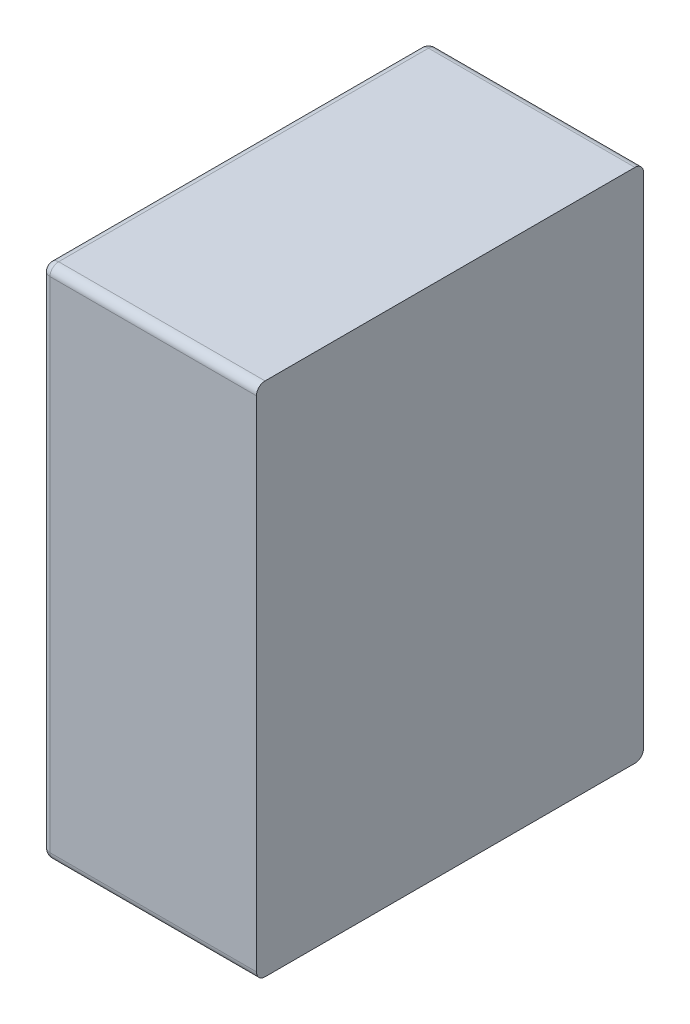
ISO-10303-21;
HEADER;
FILE_DESCRIPTION(('STEP AP214'),'2;1');
FILE_NAME('part.step','',(''),(''),'','','');
FILE_SCHEMA(('AUTOMOTIVE_DESIGN { 1 0 10303 214 1 1 1 1 }'));
ENDSEC;
DATA;
#1=APPLICATION_CONTEXT('core data for automotive mechanical design processes');
#2=APPLICATION_PROTOCOL_DEFINITION('international standard','automotive_design',2000,#1);
#3=PRODUCT_CONTEXT('',#1,'mechanical');
#4=PRODUCT('Part','Part','',(#3));
#5=PRODUCT_RELATED_PRODUCT_CATEGORY('part','',(#4));
#6=PRODUCT_DEFINITION_FORMATION('','',#4);
#7=PRODUCT_DEFINITION_CONTEXT('part definition',#1,'design');
#8=PRODUCT_DEFINITION('design','',#6,#7);
#9=PRODUCT_DEFINITION_SHAPE('','',#8);
#10=(LENGTH_UNIT() NAMED_UNIT(*) SI_UNIT(.MILLI.,.METRE.));
#11=(NAMED_UNIT(*) PLANE_ANGLE_UNIT() SI_UNIT($,.RADIAN.));
#12=(NAMED_UNIT(*) SI_UNIT($,.STERADIAN.) SOLID_ANGLE_UNIT());
#13=UNCERTAINTY_MEASURE_WITH_UNIT(LENGTH_MEASURE(1.E-05),#10,'distance_accuracy_value','');
#14=(GEOMETRIC_REPRESENTATION_CONTEXT(3) GLOBAL_UNCERTAINTY_ASSIGNED_CONTEXT((#13)) GLOBAL_UNIT_ASSIGNED_CONTEXT((#10,
#11,#12)) REPRESENTATION_CONTEXT('',''));
#15=CARTESIAN_POINT('',(0.,0.,0.));
#16=DIRECTION('',(0.,0.,1.));
#17=DIRECTION('',(1.,0.,0.));
#18=AXIS2_PLACEMENT_3D('',#15,#16,#17);
#19=CARTESIAN_POINT('',(90.1860000001231,29.5560000002051,2.013253988));
#20=DIRECTION('',(-1.,2.05103428515331E-10,0.));
#21=DIRECTION('',(-2.05103428515331E-10,-1.,0.));
#22=AXIS2_PLACEMENT_3D('',#19,#20,#21);
#23=PLANE('',#22);
#24=DIRECTION('',(0.,0.,-1.));
#25=VECTOR('',#24,1.);
#26=CARTESIAN_POINT('',(90.185999999881,28.376000000201,2.013253988));
#27=LINE('',#26,#25);
#28=CARTESIAN_POINT('',(90.185999999881,28.3760000002031,2.893253988));
#29=VERTEX_POINT('',#28);
#30=CARTESIAN_POINT('',(90.185999999881,28.3760000002031,2.033253988));
#31=VERTEX_POINT('',#30);
#32=EDGE_CURVE('E106',#29,#31,#27,.T.);
#33=ORIENTED_EDGE('',*,*,#32,.F.);
#34=DIRECTION('',(-2.05103428515331E-10,-1.,0.));
#35=VECTOR('',#34,1.);
#36=CARTESIAN_POINT('',(90.1860000001231,29.5560000002051,2.893253988));
#37=LINE('',#36,#35);
#38=CARTESIAN_POINT('',(90.186000000119,29.5360000002051,2.89325398800019));
#39=VERTEX_POINT('',#38);
#40=EDGE_CURVE('E101',#39,#29,#37,.T.);
#41=ORIENTED_EDGE('',*,*,#40,.F.);
#42=DIRECTION('',(0.,0.,1.));
#43=VECTOR('',#42,1.);
#44=CARTESIAN_POINT('',(90.186000000119,29.5360000002051,2.013253988));
#45=LINE('',#44,#43);
#46=CARTESIAN_POINT('',(90.186000000119,29.5360000002051,2.033253988));
#47=VERTEX_POINT('',#46);
#48=EDGE_CURVE('E104',#47,#39,#45,.T.);
#49=ORIENTED_EDGE('',*,*,#48,.F.);
#50=DIRECTION('',(2.05103428515331E-10,1.,0.));
#51=VECTOR('',#50,1.);
#52=CARTESIAN_POINT('',(90.1860000001231,29.5560000002051,2.033253988));
#53=LINE('',#52,#51);
#54=EDGE_CURVE('E168',#31,#47,#53,.T.);
#55=ORIENTED_EDGE('',*,*,#54,.F.);
#56=EDGE_LOOP('',(#33,#41,#49,#55));
#57=FACE_BOUND('',#56,.T.);
#58=ADVANCED_FACE('F17',(#57),#23,.T.);
#59=CARTESIAN_POINT('',(90.205999999881,28.376000000201,2.893253988));
#60=DIRECTION('',(-2.05103428515331E-10,-1.,0.));
#61=DIRECTION('',(1.,-2.05103428515331E-10,0.));
#62=AXIS2_PLACEMENT_3D('',#59,#60,#61);
#63=SPHERICAL_SURFACE('',#62,0.02);
#64=CARTESIAN_POINT('',(90.2059999998811,28.376000000201,2.893253988));
#65=DIRECTION('',(-2.05103428515331E-10,-1.,0.));
#66=DIRECTION('',(1.,-2.05103428515331E-10,0.));
#67=AXIS2_PLACEMENT_3D('',#64,#65,#66);
#68=CIRCLE('',#67,0.02);
#69=CARTESIAN_POINT('',(90.205999999881,28.3760000001517,2.913253988));
#70=VERTEX_POINT('',#69);
#71=EDGE_CURVE('E109',#29,#70,#68,.F.);
#72=ORIENTED_EDGE('',*,*,#71,.F.);
#73=CARTESIAN_POINT('',(90.205999999881,28.376000000201,2.893253988));
#74=DIRECTION('',(0.,0.,-1.));
#75=DIRECTION('',(-1.,0.,0.));
#76=AXIS2_PLACEMENT_3D('',#73,#74,#75);
#77=CIRCLE('',#76,0.02);
#78=CARTESIAN_POINT('',(90.205999999877,28.356000000201,2.893253988));
#79=VERTEX_POINT('',#78);
#80=EDGE_CURVE('E165',#79,#29,#77,.T.);
#81=ORIENTED_EDGE('',*,*,#80,.F.);
#82=CARTESIAN_POINT('',(90.205999999881,28.376000000201,2.893253988));
#83=DIRECTION('',(1.,-2.05103428515331E-10,0.));
#84=DIRECTION('',(2.05103428515331E-10,1.,0.));
#85=AXIS2_PLACEMENT_3D('',#82,#83,#84);
#86=CIRCLE('',#85,0.02);
#87=EDGE_CURVE('E231',#70,#79,#86,.T.);
#88=ORIENTED_EDGE('',*,*,#87,.F.);
#89=EDGE_LOOP('',(#72,#81,#88));
#90=FACE_BOUND('',#89,.T.);
#91=ADVANCED_FACE('F155',(#90),#63,.T.);
#92=CARTESIAN_POINT('',(90.2060000001231,29.556000000201,2.893253988));
#93=DIRECTION('',(-2.05103428515331E-10,-1.,0.));
#94=DIRECTION('',(1.,-2.05103428515331E-10,0.));
#95=AXIS2_PLACEMENT_3D('',#92,#93,#94);
#96=CYLINDRICAL_SURFACE('',#95,0.02);
#97=ORIENTED_EDGE('',*,*,#71,.T.);
#98=DIRECTION('',(0.,1.,0.));
#99=VECTOR('',#98,1.);
#100=CARTESIAN_POINT('',(90.205999999881,28.3560000002051,2.913253988));
#101=LINE('',#100,#99);
#102=CARTESIAN_POINT('',(90.2060000000595,29.536000000201,2.913253988));
#103=VERTEX_POINT('',#102);
#104=EDGE_CURVE('E115',#70,#103,#101,.T.);
#105=ORIENTED_EDGE('',*,*,#104,.T.);
#106=CARTESIAN_POINT('',(90.206000000119,29.536000000201,2.893253988));
#107=DIRECTION('',(-2.05103428515331E-10,-1.,0.));
#108=DIRECTION('',(1.,-2.05044314860396E-10,0.));
#109=AXIS2_PLACEMENT_3D('',#106,#107,#108);
#110=CIRCLE('',#109,0.0200000000000061);
#111=EDGE_CURVE('E112',#39,#103,#110,.F.);
#112=ORIENTED_EDGE('',*,*,#111,.F.);
#113=ORIENTED_EDGE('',*,*,#40,.T.);
#114=EDGE_LOOP('',(#97,#105,#112,#113));
#115=FACE_BOUND('',#114,.T.);
#116=ADVANCED_FACE('F113',(#115),#96,.T.);
#117=CARTESIAN_POINT('',(90.206000000119,29.536000000201,2.893253988));
#118=DIRECTION('',(-2.05103428515331E-10,-1.,0.));
#119=DIRECTION('',(1.,-2.05103428515331E-10,0.));
#120=AXIS2_PLACEMENT_3D('',#117,#118,#119);
#121=SPHERICAL_SURFACE('',#120,0.02);
#122=CARTESIAN_POINT('',(90.206000000119,29.536000000201,2.893253988));
#123=DIRECTION('',(1.,-2.05103428515331E-10,0.));
#124=DIRECTION('',(2.05103428515331E-10,1.,0.));
#125=AXIS2_PLACEMENT_3D('',#122,#123,#124);
#126=CIRCLE('',#125,0.02);
#127=CARTESIAN_POINT('',(90.2060000001231,29.556000000201,2.893253988));
#128=VERTEX_POINT('',#127);
#129=EDGE_CURVE('E130',#128,#103,#126,.T.);
#130=ORIENTED_EDGE('',*,*,#129,.F.);
#131=CARTESIAN_POINT('',(90.206000000119,29.536000000201,2.893253988));
#132=DIRECTION('',(0.,0.,1.));
#133=DIRECTION('',(1.,0.,0.));
#134=AXIS2_PLACEMENT_3D('',#131,#132,#133);
#135=CIRCLE('',#134,0.02);
#136=EDGE_CURVE('E121',#39,#128,#135,.F.);
#137=ORIENTED_EDGE('',*,*,#136,.F.);
#138=ORIENTED_EDGE('',*,*,#111,.T.);
#139=EDGE_LOOP('',(#130,#137,#138));
#140=FACE_BOUND('',#139,.T.);
#141=ADVANCED_FACE('F129',(#140),#121,.T.);
#142=CARTESIAN_POINT('',(90.206000000119,29.536000000201,2.013253988));
#143=DIRECTION('',(0.,0.,1.));
#144=DIRECTION('',(1.,0.,0.));
#145=AXIS2_PLACEMENT_3D('',#142,#143,#144);
#146=CYLINDRICAL_SURFACE('',#145,0.02);
#147=CARTESIAN_POINT('',(90.206000000119,29.536000000201,2.033253988));
#148=DIRECTION('',(0.,0.,-1.));
#149=DIRECTION('',(-2.04815597475E-10,-1.,0.));
#150=AXIS2_PLACEMENT_3D('',#147,#148,#149);
#151=CIRCLE('',#150,0.02);
#152=CARTESIAN_POINT('',(90.2060000001231,29.556000000201,2.033253988));
#153=VERTEX_POINT('',#152);
#154=EDGE_CURVE('E126',#47,#153,#151,.T.);
#155=ORIENTED_EDGE('',*,*,#154,.F.);
#156=ORIENTED_EDGE('',*,*,#48,.T.);
#157=ORIENTED_EDGE('',*,*,#136,.T.);
#158=DIRECTION('',(0.,0.,1.));
#159=VECTOR('',#158,1.);
#160=CARTESIAN_POINT('',(90.2060000001231,29.556000000201,2.913253988));
#161=LINE('',#160,#159);
#162=EDGE_CURVE('E223',#128,#153,#161,.F.);
#163=ORIENTED_EDGE('',*,*,#162,.T.);
#164=EDGE_LOOP('',(#155,#156,#157,#163));
#165=FACE_BOUND('',#164,.T.);
#166=ADVANCED_FACE('F124',(#165),#146,.T.);
#167=CARTESIAN_POINT('',(90.206000000119,29.536000000201,2.033253988));
#168=DIRECTION('',(-2.05103428515331E-10,-1.,0.));
#169=DIRECTION('',(1.,-2.05103428515331E-10,0.));
#170=AXIS2_PLACEMENT_3D('',#167,#168,#169);
#171=SPHERICAL_SURFACE('',#170,0.02);
#172=CARTESIAN_POINT('',(90.206000000119,29.536000000201,2.033253988));
#173=DIRECTION('',(1.,-2.05103428515331E-10,0.));
#174=DIRECTION('',(2.05103428515331E-10,1.,0.));
#175=AXIS2_PLACEMENT_3D('',#172,#173,#174);
#176=CIRCLE('',#175,0.02);
#177=CARTESIAN_POINT('',(90.206000000119,29.5360000001517,2.013253988));
#178=VERTEX_POINT('',#177);
#179=EDGE_CURVE('E218',#178,#153,#176,.T.);
#180=ORIENTED_EDGE('',*,*,#179,.F.);
#181=CARTESIAN_POINT('',(90.206000000119,29.536000000201,2.033253988));
#182=DIRECTION('',(2.05103428515331E-10,1.,0.));
#183=DIRECTION('',(-1.,2.05103428515331E-10,0.));
#184=AXIS2_PLACEMENT_3D('',#181,#182,#183);
#185=CIRCLE('',#184,0.02);
#186=EDGE_CURVE('E171',#47,#178,#185,.F.);
#187=ORIENTED_EDGE('',*,*,#186,.F.);
#188=ORIENTED_EDGE('',*,*,#154,.T.);
#189=EDGE_LOOP('',(#180,#187,#188));
#190=FACE_BOUND('',#189,.T.);
#191=ADVANCED_FACE('F267',(#190),#171,.T.);
#192=CARTESIAN_POINT('',(90.2060000001231,29.556000000201,2.033253988));
#193=DIRECTION('',(2.05103428515331E-10,1.,0.));
#194=DIRECTION('',(-1.,2.05103428515331E-10,0.));
#195=AXIS2_PLACEMENT_3D('',#192,#193,#194);
#196=CYLINDRICAL_SURFACE('',#195,0.02);
#197=CARTESIAN_POINT('',(90.205999999881,28.376000000201,2.033253988));
#198=DIRECTION('',(-2.05103428515331E-10,-1.,0.));
#199=DIRECTION('',(1.,-2.05044314860396E-10,0.));
#200=AXIS2_PLACEMENT_3D('',#197,#198,#199);
#201=CIRCLE('',#200,0.0200000000000061);
#202=CARTESIAN_POINT('',(90.2059999999406,28.376000000201,2.013253988));
#203=VERTEX_POINT('',#202);
#204=EDGE_CURVE('E170',#31,#203,#201,.T.);
#205=ORIENTED_EDGE('',*,*,#204,.F.);
#206=ORIENTED_EDGE('',*,*,#54,.T.);
#207=ORIENTED_EDGE('',*,*,#186,.T.);
#208=DIRECTION('',(0.,1.,0.));
#209=VECTOR('',#208,1.);
#210=CARTESIAN_POINT('',(90.206000000119,29.5560000002051,2.013253988));
#211=LINE('',#210,#209);
#212=EDGE_CURVE('E213',#178,#203,#211,.F.);
#213=ORIENTED_EDGE('',*,*,#212,.T.);
#214=EDGE_LOOP('',(#205,#206,#207,#213));
#215=FACE_BOUND('',#214,.T.);
#216=ADVANCED_FACE('F263',(#215),#196,.T.);
#217=CARTESIAN_POINT('',(90.205999999881,28.376000000201,2.033253988));
#218=DIRECTION('',(-2.05103428515331E-10,-1.,0.));
#219=DIRECTION('',(1.,-2.05103428515331E-10,0.));
#220=AXIS2_PLACEMENT_3D('',#217,#218,#219);
#221=SPHERICAL_SURFACE('',#220,0.02);
#222=ORIENTED_EDGE('',*,*,#204,.T.);
#223=CARTESIAN_POINT('',(90.2059999998811,28.376000000201,2.033253988));
#224=DIRECTION('',(1.,-2.05103428515331E-10,0.));
#225=DIRECTION('',(2.05103428515331E-10,1.,0.));
#226=AXIS2_PLACEMENT_3D('',#223,#224,#225);
#227=CIRCLE('',#226,0.02);
#228=CARTESIAN_POINT('',(90.205999999877,28.356000000201,2.033253988));
#229=VERTEX_POINT('',#228);
#230=EDGE_CURVE('E207',#229,#203,#227,.T.);
#231=ORIENTED_EDGE('',*,*,#230,.F.);
#232=CARTESIAN_POINT('',(90.205999999881,28.376000000201,2.033253988));
#233=DIRECTION('',(0.,0.,-1.));
#234=DIRECTION('',(-1.,0.,0.));
#235=AXIS2_PLACEMENT_3D('',#232,#233,#234);
#236=CIRCLE('',#235,0.02);
#237=EDGE_CURVE('E66',#31,#229,#236,.F.);
#238=ORIENTED_EDGE('',*,*,#237,.F.);
#239=EDGE_LOOP('',(#222,#231,#238));
#240=FACE_BOUND('',#239,.T.);
#241=ADVANCED_FACE('F258',(#240),#221,.T.);
#242=CARTESIAN_POINT('',(90.205999999881,28.376000000201,2.013253988));
#243=DIRECTION('',(0.,0.,-1.));
#244=DIRECTION('',(-1.,0.,0.));
#245=AXIS2_PLACEMENT_3D('',#242,#243,#244);
#246=CYLINDRICAL_SURFACE('',#245,0.02);
#247=ORIENTED_EDGE('',*,*,#237,.T.);
#248=DIRECTION('',(0.,0.,1.));
#249=VECTOR('',#248,1.);
#250=CARTESIAN_POINT('',(90.205999999877,28.356000000201,2.013253988));
#251=LINE('',#250,#249);
#252=EDGE_CURVE('E195',#229,#79,#251,.T.);
#253=ORIENTED_EDGE('',*,*,#252,.T.);
#254=ORIENTED_EDGE('',*,*,#80,.T.);
#255=ORIENTED_EDGE('',*,*,#32,.T.);
#256=EDGE_LOOP('',(#247,#253,#254,#255));
#257=FACE_BOUND('',#256,.T.);
#258=ADVANCED_FACE('F262',(#257),#246,.T.);
#259=CARTESIAN_POINT('',(90.185999999881,28.3760000002051,2.893253988));
#260=DIRECTION('',(1.,-2.05103428515331E-10,0.));
#261=DIRECTION('',(2.05103428515331E-10,1.,0.));
#262=AXIS2_PLACEMENT_3D('',#259,#260,#261);
#263=CYLINDRICAL_SURFACE('',#262,0.02);
#264=ORIENTED_EDGE('',*,*,#87,.T.);
#265=DIRECTION('',(-1.,2.05103428515331E-10,0.));
#266=VECTOR('',#265,1.);
#267=CARTESIAN_POINT('',(90.1859999998769,28.3560000002051,2.893253988));
#268=LINE('',#267,#266);
#269=CARTESIAN_POINT('',(90.685999999877,28.3560000001025,2.893253988));
#270=VERTEX_POINT('',#269);
#271=EDGE_CURVE('E199',#79,#270,#268,.F.);
#272=ORIENTED_EDGE('',*,*,#271,.T.);
#273=CARTESIAN_POINT('',(90.685999999881,28.3760000001025,2.893253988));
#274=DIRECTION('',(1.,-2.05103428515331E-10,0.));
#275=DIRECTION('',(2.05103428515331E-10,1.,0.));
#276=AXIS2_PLACEMENT_3D('',#273,#274,#275);
#277=CIRCLE('',#276,0.02);
#278=CARTESIAN_POINT('',(90.685999999881,28.3760000001025,2.913253988));
#279=VERTEX_POINT('',#278);
#280=EDGE_CURVE('E20',#270,#279,#277,.F.);
#281=ORIENTED_EDGE('',*,*,#280,.T.);
#282=DIRECTION('',(-1.,0.,0.));
#283=VECTOR('',#282,1.);
#284=CARTESIAN_POINT('',(90.1859999998769,28.3760000001025,2.913253988));
#285=LINE('',#284,#283);
#286=EDGE_CURVE('E144',#279,#70,#285,.T.);
#287=ORIENTED_EDGE('',*,*,#286,.T.);
#288=EDGE_LOOP('',(#264,#272,#281,#287));
#289=FACE_BOUND('',#288,.T.);
#290=ADVANCED_FACE('F374',(#289),#263,.T.);
#291=CARTESIAN_POINT('',(90.1859999998769,28.3560000002051,2.913253988));
#292=DIRECTION('',(0.,0.,-1.));
#293=DIRECTION('',(-1.,0.,0.));
#294=AXIS2_PLACEMENT_3D('',#291,#292,#293);
#295=PLANE('',#294);
#296=ORIENTED_EDGE('',*,*,#286,.F.);
#297=DIRECTION('',(-2.05103428515331E-10,-1.,0.));
#298=VECTOR('',#297,1.);
#299=CARTESIAN_POINT('',(90.6860000001231,29.5560000001026,2.913253988));
#300=LINE('',#299,#298);
#301=CARTESIAN_POINT('',(90.686000000119,29.5360000001025,2.913253988));
#302=VERTEX_POINT('',#301);
#303=EDGE_CURVE('E186',#279,#302,#300,.F.);
#304=ORIENTED_EDGE('',*,*,#303,.T.);
#305=DIRECTION('',(1.,-2.05103428515331E-10,0.));
#306=VECTOR('',#305,1.);
#307=CARTESIAN_POINT('',(90.186000000119,29.5360000002051,2.913253988));
#308=LINE('',#307,#306);
#309=EDGE_CURVE('E140',#103,#302,#308,.T.);
#310=ORIENTED_EDGE('',*,*,#309,.F.);
#311=ORIENTED_EDGE('',*,*,#104,.F.);
#312=EDGE_LOOP('',(#296,#304,#310,#311));
#313=FACE_BOUND('',#312,.T.);
#314=ADVANCED_FACE('F365',(#313),#295,.F.);
#315=CARTESIAN_POINT('',(90.186000000119,29.5360000002051,2.893253988));
#316=DIRECTION('',(1.,-2.05103428515331E-10,0.));
#317=DIRECTION('',(2.05103428515331E-10,1.,0.));
#318=AXIS2_PLACEMENT_3D('',#315,#316,#317);
#319=CYLINDRICAL_SURFACE('',#318,0.02);
#320=CARTESIAN_POINT('',(90.686000000119,29.5360000001025,2.893253988));
#321=DIRECTION('',(1.,-2.05103428515331E-10,0.));
#322=DIRECTION('',(2.05103428515331E-10,1.,0.));
#323=AXIS2_PLACEMENT_3D('',#320,#321,#322);
#324=CIRCLE('',#323,0.02);
#325=CARTESIAN_POINT('',(90.6860000001231,29.5560000001026,2.893253988));
#326=VERTEX_POINT('',#325);
#327=EDGE_CURVE('E184',#302,#326,#324,.F.);
#328=ORIENTED_EDGE('',*,*,#327,.T.);
#329=DIRECTION('',(1.,-2.05103428515331E-10,0.));
#330=VECTOR('',#329,1.);
#331=CARTESIAN_POINT('',(90.1860000001231,29.5560000002051,2.893253988));
#332=LINE('',#331,#330);
#333=EDGE_CURVE('E221',#326,#128,#332,.F.);
#334=ORIENTED_EDGE('',*,*,#333,.T.);
#335=ORIENTED_EDGE('',*,*,#129,.T.);
#336=ORIENTED_EDGE('',*,*,#309,.T.);
#337=EDGE_LOOP('',(#328,#334,#335,#336));
#338=FACE_BOUND('',#337,.T.);
#339=ADVANCED_FACE('F356',(#338),#319,.T.);
#340=CARTESIAN_POINT('',(90.1860000001231,29.5560000002051,2.913253988));
#341=DIRECTION('',(-2.05103428515331E-10,-1.,0.));
#342=DIRECTION('',(1.,-2.05103428515331E-10,0.));
#343=AXIS2_PLACEMENT_3D('',#340,#341,#342);
#344=PLANE('',#343);
#345=DIRECTION('',(1.,-2.05103428515331E-10,0.));
#346=VECTOR('',#345,1.);
#347=CARTESIAN_POINT('',(90.1860000001231,29.5560000002051,2.033253988));
#348=LINE('',#347,#346);
#349=CARTESIAN_POINT('',(90.6860000001231,29.5560000001026,2.033253988));
#350=VERTEX_POINT('',#349);
#351=EDGE_CURVE('E214',#153,#350,#348,.T.);
#352=ORIENTED_EDGE('',*,*,#351,.F.);
#353=ORIENTED_EDGE('',*,*,#162,.F.);
#354=ORIENTED_EDGE('',*,*,#333,.F.);
#355=DIRECTION('',(0.,0.,1.));
#356=VECTOR('',#355,1.);
#357=CARTESIAN_POINT('',(90.6860000001231,29.5560000001026,2.013253988));
#358=LINE('',#357,#356);
#359=EDGE_CURVE('E183',#326,#350,#358,.F.);
#360=ORIENTED_EDGE('',*,*,#359,.T.);
#361=EDGE_LOOP('',(#352,#353,#354,#360));
#362=FACE_BOUND('',#361,.T.);
#363=ADVANCED_FACE('F288',(#362),#344,.F.);
#364=CARTESIAN_POINT('',(90.186000000119,29.5360000002051,2.033253988));
#365=DIRECTION('',(1.,-2.05103428515331E-10,0.));
#366=DIRECTION('',(2.05103428515331E-10,1.,0.));
#367=AXIS2_PLACEMENT_3D('',#364,#365,#366);
#368=CYLINDRICAL_SURFACE('',#367,0.02);
#369=ORIENTED_EDGE('',*,*,#179,.T.);
#370=ORIENTED_EDGE('',*,*,#351,.T.);
#371=CARTESIAN_POINT('',(90.686000000119,29.5360000001025,2.033253988));
#372=DIRECTION('',(1.,-2.05103428515331E-10,0.));
#373=DIRECTION('',(2.05103428515331E-10,1.,0.));
#374=AXIS2_PLACEMENT_3D('',#371,#372,#373);
#375=CIRCLE('',#374,0.02);
#376=CARTESIAN_POINT('',(90.686000000119,29.5360000001025,2.013253988));
#377=VERTEX_POINT('',#376);
#378=EDGE_CURVE('E181',#350,#377,#375,.F.);
#379=ORIENTED_EDGE('',*,*,#378,.T.);
#380=DIRECTION('',(1.,0.,0.));
#381=VECTOR('',#380,1.);
#382=CARTESIAN_POINT('',(90.1860000001231,29.5360000001025,2.013253988));
#383=LINE('',#382,#381);
#384=EDGE_CURVE('E210',#377,#178,#383,.F.);
#385=ORIENTED_EDGE('',*,*,#384,.T.);
#386=EDGE_LOOP('',(#369,#370,#379,#385));
#387=FACE_BOUND('',#386,.T.);
#388=ADVANCED_FACE('F292',(#387),#368,.T.);
#389=CARTESIAN_POINT('',(90.1860000001231,29.5560000002051,2.013253988));
#390=DIRECTION('',(0.,0.,1.));
#391=DIRECTION('',(1.,0.,0.));
#392=AXIS2_PLACEMENT_3D('',#389,#390,#391);
#393=PLANE('',#392);
#394=DIRECTION('',(1.,-2.05103428515331E-10,0.));
#395=VECTOR('',#394,1.);
#396=CARTESIAN_POINT('',(90.185999999881,28.3760000002051,2.013253988));
#397=LINE('',#396,#395);
#398=CARTESIAN_POINT('',(90.685999999881,28.3760000001025,2.013253988));
#399=VERTEX_POINT('',#398);
#400=EDGE_CURVE('E203',#203,#399,#397,.T.);
#401=ORIENTED_EDGE('',*,*,#400,.F.);
#402=ORIENTED_EDGE('',*,*,#212,.F.);
#403=ORIENTED_EDGE('',*,*,#384,.F.);
#404=DIRECTION('',(-2.05103428515331E-10,-1.,0.));
#405=VECTOR('',#404,1.);
#406=CARTESIAN_POINT('',(90.6860000001231,29.5560000001026,2.013253988));
#407=LINE('',#406,#405);
#408=EDGE_CURVE('E180',#377,#399,#407,.T.);
#409=ORIENTED_EDGE('',*,*,#408,.T.);
#410=EDGE_LOOP('',(#401,#402,#403,#409));
#411=FACE_BOUND('',#410,.T.);
#412=ADVANCED_FACE('F299',(#411),#393,.F.);
#413=CARTESIAN_POINT('',(90.185999999881,28.3760000002051,2.033253988));
#414=DIRECTION('',(1.,-2.05103428515331E-10,0.));
#415=DIRECTION('',(2.05103428515331E-10,1.,0.));
#416=AXIS2_PLACEMENT_3D('',#413,#414,#415);
#417=CYLINDRICAL_SURFACE('',#416,0.02);
#418=CARTESIAN_POINT('',(90.685999999881,28.3760000001025,2.033253988));
#419=DIRECTION('',(1.,-2.05103428515331E-10,0.));
#420=DIRECTION('',(2.05103428515331E-10,1.,0.));
#421=AXIS2_PLACEMENT_3D('',#418,#419,#420);
#422=CIRCLE('',#421,0.02);
#423=CARTESIAN_POINT('',(90.6859999998769,28.3560000001025,2.033253988));
#424=VERTEX_POINT('',#423);
#425=EDGE_CURVE('E26',#399,#424,#422,.F.);
#426=ORIENTED_EDGE('',*,*,#425,.T.);
#427=DIRECTION('',(-1.,2.05103428515331E-10,0.));
#428=VECTOR('',#427,1.);
#429=CARTESIAN_POINT('',(90.1859999998769,28.3560000002051,2.033253988));
#430=LINE('',#429,#428);
#431=EDGE_CURVE('E34',#424,#229,#430,.T.);
#432=ORIENTED_EDGE('',*,*,#431,.T.);
#433=ORIENTED_EDGE('',*,*,#230,.T.);
#434=ORIENTED_EDGE('',*,*,#400,.T.);
#435=EDGE_LOOP('',(#426,#432,#433,#434));
#436=FACE_BOUND('',#435,.T.);
#437=ADVANCED_FACE('F306',(#436),#417,.T.);
#438=CARTESIAN_POINT('',(90.1859999998769,28.3560000002051,2.013253988));
#439=DIRECTION('',(2.05103428515331E-10,1.,0.));
#440=DIRECTION('',(-1.,2.05103428515331E-10,0.));
#441=AXIS2_PLACEMENT_3D('',#438,#439,#440);
#442=PLANE('',#441);
#443=ORIENTED_EDGE('',*,*,#431,.F.);
#444=DIRECTION('',(0.,0.,1.));
#445=VECTOR('',#444,1.);
#446=CARTESIAN_POINT('',(90.685999999877,28.3560000001025,2.013253988));
#447=LINE('',#446,#445);
#448=EDGE_CURVE('E11',#424,#270,#447,.T.);
#449=ORIENTED_EDGE('',*,*,#448,.T.);
#450=ORIENTED_EDGE('',*,*,#271,.F.);
#451=ORIENTED_EDGE('',*,*,#252,.F.);
#452=EDGE_LOOP('',(#443,#449,#450,#451));
#453=FACE_BOUND('',#452,.T.);
#454=ADVANCED_FACE('F304',(#453),#442,.F.);
#455=CARTESIAN_POINT('',(90.6860000001231,29.5560000001026,2.013253988));
#456=DIRECTION('',(-1.,2.05103428515331E-10,0.));
#457=DIRECTION('',(-2.05103428515331E-10,-1.,0.));
#458=AXIS2_PLACEMENT_3D('',#455,#456,#457);
#459=PLANE('',#458);
#460=ORIENTED_EDGE('',*,*,#425,.F.);
#461=ORIENTED_EDGE('',*,*,#408,.F.);
#462=ORIENTED_EDGE('',*,*,#378,.F.);
#463=ORIENTED_EDGE('',*,*,#359,.F.);
#464=ORIENTED_EDGE('',*,*,#327,.F.);
#465=ORIENTED_EDGE('',*,*,#303,.F.);
#466=ORIENTED_EDGE('',*,*,#280,.F.);
#467=ORIENTED_EDGE('',*,*,#448,.F.);
#468=EDGE_LOOP('',(#460,#461,#462,#463,#464,#465,#466,#467));
#469=FACE_BOUND('',#468,.T.);
#470=ADVANCED_FACE('F295',(#469),#459,.F.);
#471=CLOSED_SHELL('',(#58,#91,#116,#141,#166,#191,#216,#241,#258,#290,#314,#339,#363,#388,#412,
#437,#454,#470));
#472=MANIFOLD_SOLID_BREP('B1',#471);
#473=ADVANCED_BREP_SHAPE_REPRESENTATION('',(#18,#472),#14);
#474=SHAPE_DEFINITION_REPRESENTATION(#9,#473);
ENDSEC;
END-ISO-10303-21;
